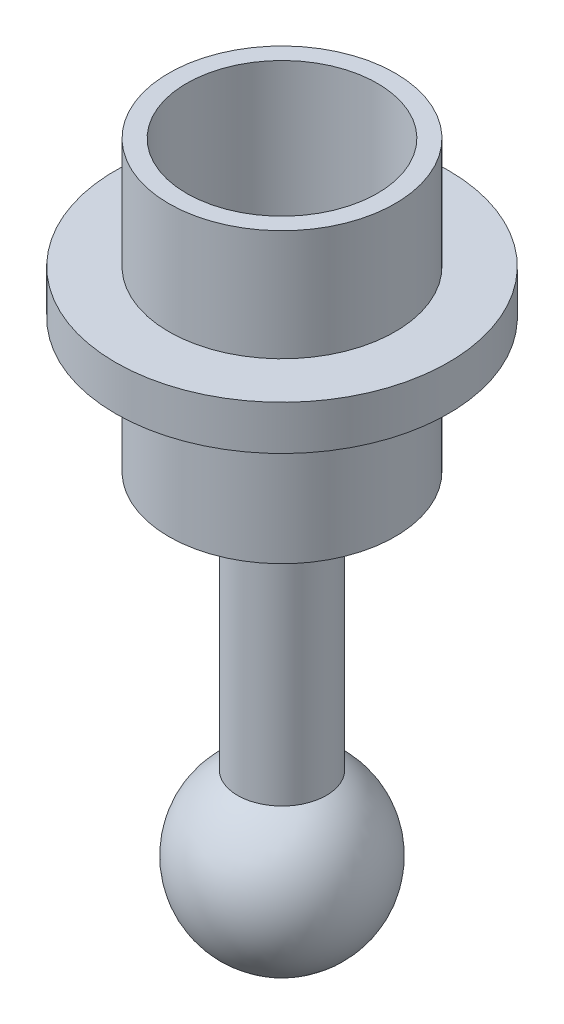
ISO-10303-21;
HEADER;
FILE_DESCRIPTION(('STEP AP214'),'2;1');
FILE_NAME('part.step','',(''),(''),'','','');
FILE_SCHEMA(('AUTOMOTIVE_DESIGN { 1 0 10303 214 1 1 1 1 }'));
ENDSEC;
DATA;
#1=APPLICATION_CONTEXT('core data for automotive mechanical design processes');
#2=APPLICATION_PROTOCOL_DEFINITION('international standard','automotive_design',2000,#1);
#3=PRODUCT_CONTEXT('',#1,'mechanical');
#4=PRODUCT('Part','Part','',(#3));
#5=PRODUCT_RELATED_PRODUCT_CATEGORY('part','',(#4));
#6=PRODUCT_DEFINITION_FORMATION('','',#4);
#7=PRODUCT_DEFINITION_CONTEXT('part definition',#1,'design');
#8=PRODUCT_DEFINITION('design','',#6,#7);
#9=PRODUCT_DEFINITION_SHAPE('','',#8);
#10=(LENGTH_UNIT() NAMED_UNIT(*) SI_UNIT(.MILLI.,.METRE.));
#11=(NAMED_UNIT(*) PLANE_ANGLE_UNIT() SI_UNIT($,.RADIAN.));
#12=(NAMED_UNIT(*) SI_UNIT($,.STERADIAN.) SOLID_ANGLE_UNIT());
#13=UNCERTAINTY_MEASURE_WITH_UNIT(LENGTH_MEASURE(1.E-05),#10,'distance_accuracy_value','');
#14=(GEOMETRIC_REPRESENTATION_CONTEXT(3) GLOBAL_UNCERTAINTY_ASSIGNED_CONTEXT((#13)) GLOBAL_UNIT_ASSIGNED_CONTEXT((#10,
#11,#12)) REPRESENTATION_CONTEXT('',''));
#15=CARTESIAN_POINT('',(0.,0.,0.));
#16=DIRECTION('',(0.,0.,1.));
#17=DIRECTION('',(1.,0.,0.));
#18=AXIS2_PLACEMENT_3D('',#15,#16,#17);
#19=CARTESIAN_POINT('',(0.,1.,0.));
#20=DIRECTION('',(0.,-1.,0.));
#21=DIRECTION('',(0.,0.,-1.));
#22=AXIS2_PLACEMENT_3D('',#19,#20,#21);
#23=CYLINDRICAL_SURFACE('',#22,5.1);
#24=CARTESIAN_POINT('',(0.,0.,0.));
#25=DIRECTION('',(0.,1.,0.));
#26=DIRECTION('',(0.,0.,1.));
#27=AXIS2_PLACEMENT_3D('',#24,#25,#26);
#28=CIRCLE('',#27,5.1);
#29=CARTESIAN_POINT('',(0.,0.,5.1));
#30=VERTEX_POINT('',#29);
#31=EDGE_CURVE('E405',#30,#30,#28,.T.);
#32=ORIENTED_EDGE('',*,*,#31,.T.);
#33=EDGE_LOOP('',(#32));
#34=FACE_BOUND('',#33,.T.);
#35=CARTESIAN_POINT('',(0.,6.,0.));
#36=DIRECTION('',(0.,1.,0.));
#37=DIRECTION('',(0.,0.,1.));
#38=AXIS2_PLACEMENT_3D('',#35,#36,#37);
#39=CIRCLE('',#38,5.1);
#40=CARTESIAN_POINT('',(0.,6.,5.1));
#41=VERTEX_POINT('',#40);
#42=EDGE_CURVE('E11',#41,#41,#39,.T.);
#43=ORIENTED_EDGE('',*,*,#42,.F.);
#44=EDGE_LOOP('',(#43));
#45=FACE_BOUND('',#44,.T.);
#46=ADVANCED_FACE('F45',(#34,#45),#23,.T.);
#47=CARTESIAN_POINT('',(0.,0.,0.));
#48=DIRECTION('',(0.,1.,0.));
#49=DIRECTION('',(0.,0.,1.));
#50=AXIS2_PLACEMENT_3D('',#47,#48,#49);
#51=PLANE('',#50);
#52=CARTESIAN_POINT('',(0.,0.,0.));
#53=DIRECTION('',(0.,1.,0.));
#54=DIRECTION('',(0.,0.,1.));
#55=AXIS2_PLACEMENT_3D('',#52,#53,#54);
#56=CIRCLE('',#55,2.);
#57=CARTESIAN_POINT('',(0.,0.,2.));
#58=VERTEX_POINT('',#57);
#59=EDGE_CURVE('E753',#58,#58,#56,.T.);
#60=ORIENTED_EDGE('',*,*,#59,.T.);
#61=EDGE_LOOP('',(#60));
#62=FACE_BOUND('',#61,.T.);
#63=CARTESIAN_POINT('',(0.,0.,0.));
#64=DIRECTION('',(0.,1.,0.));
#65=DIRECTION('',(0.,0.,1.));
#66=AXIS2_PLACEMENT_3D('',#63,#64,#65);
#67=CIRCLE('',#66,2.5);
#68=CARTESIAN_POINT('',(-2.41481456572267,0.,0.647047612756302));
#69=VERTEX_POINT('',#68);
#70=CARTESIAN_POINT('',(-1.76776695296637,0.,1.76776695296637));
#71=VERTEX_POINT('',#70);
#72=EDGE_CURVE('E328',#69,#71,#67,.T.);
#73=ORIENTED_EDGE('',*,*,#72,.F.);
#74=DIRECTION('',(0.965925826289068,0.,-0.258819045102521));
#75=VECTOR('',#74,1.);
#76=CARTESIAN_POINT('',(0.,0.,0.));
#77=LINE('',#76,#75);
#78=CARTESIAN_POINT('',(-3.18755522675393,0.,0.854102848838318));
#79=VERTEX_POINT('',#78);
#80=EDGE_CURVE('E339',#79,#69,#77,.T.);
#81=ORIENTED_EDGE('',*,*,#80,.F.);
#82=CARTESIAN_POINT('',(0.,0.,0.));
#83=DIRECTION('',(0.,1.,0.));
#84=DIRECTION('',(0.,0.,1.));
#85=AXIS2_PLACEMENT_3D('',#82,#83,#84);
#86=CIRCLE('',#85,3.3);
#87=CARTESIAN_POINT('',(-2.3334523779156,0.,2.33345237791561));
#88=VERTEX_POINT('',#87);
#89=EDGE_CURVE('E68',#79,#88,#86,.T.);
#90=ORIENTED_EDGE('',*,*,#89,.T.);
#91=DIRECTION('',(0.707106781186547,0.,-0.707106781186548));
#92=VECTOR('',#91,1.);
#93=CARTESIAN_POINT('',(0.,0.,0.));
#94=LINE('',#93,#92);
#95=EDGE_CURVE('E316',#88,#71,#94,.T.);
#96=ORIENTED_EDGE('',*,*,#95,.T.);
#97=EDGE_LOOP('',(#73,#81,#90,#96));
#98=FACE_BOUND('',#97,.T.);
#99=CARTESIAN_POINT('',(0.,0.,0.));
#100=DIRECTION('',(0.,1.,0.));
#101=DIRECTION('',(0.,0.,1.));
#102=AXIS2_PLACEMENT_3D('',#99,#100,#101);
#103=CIRCLE('',#102,2.5);
#104=CARTESIAN_POINT('',(1.76776695296637,0.,1.76776695296637));
#105=VERTEX_POINT('',#104);
#106=CARTESIAN_POINT('',(2.41481456572267,0.,0.647047612756299));
#107=VERTEX_POINT('',#106);
#108=EDGE_CURVE('E266',#105,#107,#103,.T.);
#109=ORIENTED_EDGE('',*,*,#108,.F.);
#110=DIRECTION('',(-0.707106781186548,0.,-0.707106781186547));
#111=VECTOR('',#110,1.);
#112=CARTESIAN_POINT('',(0.,0.,0.));
#113=LINE('',#112,#111);
#114=CARTESIAN_POINT('',(2.33345237791561,0.,2.33345237791561));
#115=VERTEX_POINT('',#114);
#116=EDGE_CURVE('E279',#115,#105,#113,.T.);
#117=ORIENTED_EDGE('',*,*,#116,.F.);
#118=CARTESIAN_POINT('',(0.,0.,0.));
#119=DIRECTION('',(0.,1.,0.));
#120=DIRECTION('',(0.,0.,1.));
#121=AXIS2_PLACEMENT_3D('',#118,#119,#120);
#122=CIRCLE('',#121,3.3);
#123=CARTESIAN_POINT('',(3.18755522675393,0.,0.854102848838315));
#124=VERTEX_POINT('',#123);
#125=EDGE_CURVE('E276',#115,#124,#122,.T.);
#126=ORIENTED_EDGE('',*,*,#125,.T.);
#127=DIRECTION('',(-0.965925826289069,0.,-0.258819045102519));
#128=VECTOR('',#127,1.);
#129=CARTESIAN_POINT('',(0.,0.,0.));
#130=LINE('',#129,#128);
#131=EDGE_CURVE('E254',#124,#107,#130,.T.);
#132=ORIENTED_EDGE('',*,*,#131,.T.);
#133=EDGE_LOOP('',(#109,#117,#126,#132));
#134=FACE_BOUND('',#133,.T.);
#135=CARTESIAN_POINT('',(0.,0.,0.));
#136=DIRECTION('',(0.,1.,0.));
#137=DIRECTION('',(0.,0.,1.));
#138=AXIS2_PLACEMENT_3D('',#135,#136,#137);
#139=CIRCLE('',#138,2.5);
#140=CARTESIAN_POINT('',(-1.76776695296637,0.,-1.76776695296637));
#141=VERTEX_POINT('',#140);
#142=CARTESIAN_POINT('',(-2.41481456572267,0.,-0.647047612756298));
#143=VERTEX_POINT('',#142);
#144=EDGE_CURVE('E372',#141,#143,#139,.T.);
#145=ORIENTED_EDGE('',*,*,#144,.F.);
#146=DIRECTION('',(0.707106781186548,0.,0.707106781186547));
#147=VECTOR('',#146,1.);
#148=CARTESIAN_POINT('',(0.,0.,0.));
#149=LINE('',#148,#147);
#150=CARTESIAN_POINT('',(-2.33345237791561,0.,-2.33345237791561));
#151=VERTEX_POINT('',#150);
#152=EDGE_CURVE('E374',#151,#141,#149,.T.);
#153=ORIENTED_EDGE('',*,*,#152,.F.);
#154=CARTESIAN_POINT('',(0.,0.,0.));
#155=DIRECTION('',(0.,1.,0.));
#156=DIRECTION('',(0.,0.,1.));
#157=AXIS2_PLACEMENT_3D('',#154,#155,#156);
#158=CIRCLE('',#157,3.3);
#159=CARTESIAN_POINT('',(-3.18755522675393,0.,-0.854102848838313));
#160=VERTEX_POINT('',#159);
#161=EDGE_CURVE('E377',#151,#160,#158,.T.);
#162=ORIENTED_EDGE('',*,*,#161,.T.);
#163=DIRECTION('',(0.965925826289069,0.,0.258819045102519));
#164=VECTOR('',#163,1.);
#165=CARTESIAN_POINT('',(0.,0.,0.));
#166=LINE('',#165,#164);
#167=EDGE_CURVE('E380',#160,#143,#166,.T.);
#168=ORIENTED_EDGE('',*,*,#167,.T.);
#169=EDGE_LOOP('',(#145,#153,#162,#168));
#170=FACE_BOUND('',#169,.T.);
#171=ORIENTED_EDGE('',*,*,#31,.F.);
#172=EDGE_LOOP('',(#171));
#173=FACE_BOUND('',#172,.T.);
#174=CARTESIAN_POINT('',(0.,0.,0.));
#175=DIRECTION('',(0.,1.,0.));
#176=DIRECTION('',(0.,0.,1.));
#177=AXIS2_PLACEMENT_3D('',#174,#175,#176);
#178=CIRCLE('',#177,2.5);
#179=CARTESIAN_POINT('',(2.41481456572267,0.,-0.647047612756301));
#180=VERTEX_POINT('',#179);
#181=CARTESIAN_POINT('',(1.76776695296637,0.,-1.76776695296637));
#182=VERTEX_POINT('',#181);
#183=EDGE_CURVE('E214',#180,#182,#178,.T.);
#184=ORIENTED_EDGE('',*,*,#183,.F.);
#185=DIRECTION('',(-0.965925826289068,0.,0.25881904510252));
#186=VECTOR('',#185,1.);
#187=CARTESIAN_POINT('',(0.,0.,0.));
#188=LINE('',#187,#186);
#189=CARTESIAN_POINT('',(3.18755522675393,0.,-0.854102848838317));
#190=VERTEX_POINT('',#189);
#191=EDGE_CURVE('E248',#190,#180,#188,.T.);
#192=ORIENTED_EDGE('',*,*,#191,.F.);
#193=CARTESIAN_POINT('',(0.,0.,0.));
#194=DIRECTION('',(0.,1.,0.));
#195=DIRECTION('',(0.,0.,1.));
#196=AXIS2_PLACEMENT_3D('',#193,#194,#195);
#197=CIRCLE('',#196,3.3);
#198=CARTESIAN_POINT('',(2.3334523779156,0.,-2.33345237791561));
#199=VERTEX_POINT('',#198);
#200=EDGE_CURVE('E244',#190,#199,#197,.T.);
#201=ORIENTED_EDGE('',*,*,#200,.T.);
#202=DIRECTION('',(-0.707106781186547,0.,0.707106781186548));
#203=VECTOR('',#202,1.);
#204=CARTESIAN_POINT('',(0.,0.,0.));
#205=LINE('',#204,#203);
#206=EDGE_CURVE('E242',#199,#182,#205,.T.);
#207=ORIENTED_EDGE('',*,*,#206,.T.);
#208=EDGE_LOOP('',(#184,#192,#201,#207));
#209=FACE_BOUND('',#208,.T.);
#210=CARTESIAN_POINT('',(0.,0.,0.));
#211=DIRECTION('',(0.,1.,0.));
#212=DIRECTION('',(0.,0.,1.));
#213=AXIS2_PLACEMENT_3D('',#210,#211,#212);
#214=CIRCLE('',#213,2.5);
#215=CARTESIAN_POINT('',(-0.647047612756303,0.,2.41481456572267));
#216=VERTEX_POINT('',#215);
#217=CARTESIAN_POINT('',(0.647047612756304,0.,2.41481456572267));
#218=VERTEX_POINT('',#217);
#219=EDGE_CURVE('E297',#216,#218,#214,.T.);
#220=ORIENTED_EDGE('',*,*,#219,.F.);
#221=DIRECTION('',(0.258819045102521,0.,-0.965925826289068));
#222=VECTOR('',#221,1.);
#223=CARTESIAN_POINT('',(0.,0.,0.));
#224=LINE('',#223,#222);
#225=CARTESIAN_POINT('',(-0.85410284883832,0.,3.18755522675393));
#226=VERTEX_POINT('',#225);
#227=EDGE_CURVE('E310',#226,#216,#224,.T.);
#228=ORIENTED_EDGE('',*,*,#227,.F.);
#229=CARTESIAN_POINT('',(0.,0.,0.));
#230=DIRECTION('',(0.,1.,0.));
#231=DIRECTION('',(0.,0.,1.));
#232=AXIS2_PLACEMENT_3D('',#229,#230,#231);
#233=CIRCLE('',#232,3.3);
#234=CARTESIAN_POINT('',(0.854102848838322,0.,3.18755522675392));
#235=VERTEX_POINT('',#234);
#236=EDGE_CURVE('E307',#226,#235,#233,.T.);
#237=ORIENTED_EDGE('',*,*,#236,.T.);
#238=DIRECTION('',(-0.258819045102522,0.,-0.965925826289068));
#239=VECTOR('',#238,1.);
#240=CARTESIAN_POINT('',(0.,0.,0.));
#241=LINE('',#240,#239);
#242=EDGE_CURVE('E285',#235,#218,#241,.T.);
#243=ORIENTED_EDGE('',*,*,#242,.T.);
#244=EDGE_LOOP('',(#220,#228,#237,#243));
#245=FACE_BOUND('',#244,.T.);
#246=DIRECTION('',(-0.258819045102521,0.,0.965925826289068));
#247=VECTOR('',#246,1.);
#248=CARTESIAN_POINT('',(0.854102848838321,0.,-3.18755522675393));
#249=LINE('',#248,#247);
#250=CARTESIAN_POINT('',(0.854102848838321,0.,-3.18755522675392));
#251=VERTEX_POINT('',#250);
#252=CARTESIAN_POINT('',(0.647047612756304,0.,-2.41481456572267));
#253=VERTEX_POINT('',#252);
#254=EDGE_CURVE('E358',#251,#253,#249,.T.);
#255=ORIENTED_EDGE('',*,*,#254,.F.);
#256=CARTESIAN_POINT('',(0.,0.,0.));
#257=DIRECTION('',(0.,1.,0.));
#258=DIRECTION('',(0.,0.,1.));
#259=AXIS2_PLACEMENT_3D('',#256,#257,#258);
#260=CIRCLE('',#259,3.3);
#261=CARTESIAN_POINT('',(-0.854102848838322,0.,-3.18755522675392));
#262=VERTEX_POINT('',#261);
#263=EDGE_CURVE('E353',#251,#262,#260,.T.);
#264=ORIENTED_EDGE('',*,*,#263,.T.);
#265=DIRECTION('',(0.258819045102522,0.,0.965925826289068));
#266=VECTOR('',#265,1.);
#267=CARTESIAN_POINT('',(-0.854102848838321,0.,-3.18755522675392));
#268=LINE('',#267,#266);
#269=CARTESIAN_POINT('',(-0.647047612756304,0.,-2.41481456572267));
#270=VERTEX_POINT('',#269);
#271=EDGE_CURVE('E60',#262,#270,#268,.T.);
#272=ORIENTED_EDGE('',*,*,#271,.T.);
#273=CARTESIAN_POINT('',(0.,0.,0.));
#274=DIRECTION('',(0.,1.,0.));
#275=DIRECTION('',(0.,0.,1.));
#276=AXIS2_PLACEMENT_3D('',#273,#274,#275);
#277=CIRCLE('',#276,2.5);
#278=EDGE_CURVE('E369',#253,#270,#277,.T.);
#279=ORIENTED_EDGE('',*,*,#278,.F.);
#280=EDGE_LOOP('',(#255,#264,#272,#279));
#281=FACE_BOUND('',#280,.T.);
#282=ADVANCED_FACE('F414',(#62,#98,#134,#170,#173,#209,#245,#281),#51,.F.);
#283=CARTESIAN_POINT('',(0.,1.,0.));
#284=DIRECTION('',(0.,1.,0.));
#285=DIRECTION('',(0.,0.,1.));
#286=AXIS2_PLACEMENT_3D('',#283,#284,#285);
#287=PLANE('',#286);
#288=CARTESIAN_POINT('',(0.,1.,0.));
#289=DIRECTION('',(0.,1.,0.));
#290=DIRECTION('',(0.,0.,1.));
#291=AXIS2_PLACEMENT_3D('',#288,#289,#290);
#292=CIRCLE('',#291,4.3);
#293=CARTESIAN_POINT('',(0.,1.,4.3));
#294=VERTEX_POINT('',#293);
#295=EDGE_CURVE('E53',#294,#294,#292,.F.);
#296=ORIENTED_EDGE('',*,*,#295,.F.);
#297=EDGE_LOOP('',(#296));
#298=FACE_BOUND('',#297,.T.);
#299=DIRECTION('',(0.707106781186548,0.,0.707106781186547));
#300=VECTOR('',#299,1.);
#301=CARTESIAN_POINT('',(0.,1.,0.));
#302=LINE('',#301,#300);
#303=CARTESIAN_POINT('',(-2.33345237791561,1.,-2.33345237791561));
#304=VERTEX_POINT('',#303);
#305=CARTESIAN_POINT('',(-1.76776695296637,1.,-1.76776695296637));
#306=VERTEX_POINT('',#305);
#307=EDGE_CURVE('E237',#304,#306,#302,.T.);
#308=ORIENTED_EDGE('',*,*,#307,.T.);
#309=CARTESIAN_POINT('',(0.,1.,0.));
#310=DIRECTION('',(0.,1.,0.));
#311=DIRECTION('',(0.,0.,1.));
#312=AXIS2_PLACEMENT_3D('',#309,#310,#311);
#313=CIRCLE('',#312,2.5);
#314=CARTESIAN_POINT('',(-2.41481456572267,1.,-0.647047612756298));
#315=VERTEX_POINT('',#314);
#316=EDGE_CURVE('E234',#306,#315,#313,.T.);
#317=ORIENTED_EDGE('',*,*,#316,.T.);
#318=DIRECTION('',(0.965925826289069,0.,0.258819045102519));
#319=VECTOR('',#318,1.);
#320=CARTESIAN_POINT('',(0.,1.,0.));
#321=LINE('',#320,#319);
#322=CARTESIAN_POINT('',(-3.18755522675393,1.,-0.854102848838313));
#323=VERTEX_POINT('',#322);
#324=EDGE_CURVE('E375',#323,#315,#321,.T.);
#325=ORIENTED_EDGE('',*,*,#324,.F.);
#326=CARTESIAN_POINT('',(0.,1.,0.));
#327=DIRECTION('',(0.,1.,0.));
#328=DIRECTION('',(0.,0.,1.));
#329=AXIS2_PLACEMENT_3D('',#326,#327,#328);
#330=CIRCLE('',#329,3.3);
#331=EDGE_CURVE('E386',#304,#323,#330,.T.);
#332=ORIENTED_EDGE('',*,*,#331,.F.);
#333=EDGE_LOOP('',(#308,#317,#325,#332));
#334=FACE_BOUND('',#333,.T.);
#335=DIRECTION('',(-0.965925826289068,0.,0.25881904510252));
#336=VECTOR('',#335,1.);
#337=CARTESIAN_POINT('',(0.,1.,0.));
#338=LINE('',#337,#336);
#339=CARTESIAN_POINT('',(3.18755522675393,1.,-0.854102848838317));
#340=VERTEX_POINT('',#339);
#341=CARTESIAN_POINT('',(2.41481456572267,1.,-0.6470476127563));
#342=VERTEX_POINT('',#341);
#343=EDGE_CURVE('E233',#340,#342,#338,.T.);
#344=ORIENTED_EDGE('',*,*,#343,.T.);
#345=CARTESIAN_POINT('',(0.,1.,0.));
#346=DIRECTION('',(0.,1.,0.));
#347=DIRECTION('',(0.,0.,1.));
#348=AXIS2_PLACEMENT_3D('',#345,#346,#347);
#349=CIRCLE('',#348,2.5);
#350=CARTESIAN_POINT('',(1.76776695296637,1.,-1.76776695296637));
#351=VERTEX_POINT('',#350);
#352=EDGE_CURVE('E211',#342,#351,#349,.T.);
#353=ORIENTED_EDGE('',*,*,#352,.T.);
#354=DIRECTION('',(-0.707106781186547,0.,0.707106781186548));
#355=VECTOR('',#354,1.);
#356=CARTESIAN_POINT('',(0.,1.,0.));
#357=LINE('',#356,#355);
#358=CARTESIAN_POINT('',(2.3334523779156,1.,-2.33345237791561));
#359=VERTEX_POINT('',#358);
#360=EDGE_CURVE('E222',#359,#351,#357,.T.);
#361=ORIENTED_EDGE('',*,*,#360,.F.);
#362=CARTESIAN_POINT('',(0.,1.,0.));
#363=DIRECTION('',(0.,1.,0.));
#364=DIRECTION('',(0.,0.,1.));
#365=AXIS2_PLACEMENT_3D('',#362,#363,#364);
#366=CIRCLE('',#365,3.3);
#367=EDGE_CURVE('E227',#340,#359,#366,.T.);
#368=ORIENTED_EDGE('',*,*,#367,.F.);
#369=EDGE_LOOP('',(#344,#353,#361,#368));
#370=FACE_BOUND('',#369,.T.);
#371=DIRECTION('',(-0.707106781186548,0.,-0.707106781186547));
#372=VECTOR('',#371,1.);
#373=CARTESIAN_POINT('',(0.,1.,0.));
#374=LINE('',#373,#372);
#375=CARTESIAN_POINT('',(2.33345237791561,1.,2.33345237791561));
#376=VERTEX_POINT('',#375);
#377=CARTESIAN_POINT('',(1.76776695296637,1.,1.76776695296637));
#378=VERTEX_POINT('',#377);
#379=EDGE_CURVE('E269',#376,#378,#374,.T.);
#380=ORIENTED_EDGE('',*,*,#379,.T.);
#381=CARTESIAN_POINT('',(0.,1.,0.));
#382=DIRECTION('',(0.,1.,0.));
#383=DIRECTION('',(0.,0.,1.));
#384=AXIS2_PLACEMENT_3D('',#381,#382,#383);
#385=CIRCLE('',#384,2.5);
#386=CARTESIAN_POINT('',(2.41481456572267,1.,0.647047612756299));
#387=VERTEX_POINT('',#386);
#388=EDGE_CURVE('E219',#378,#387,#385,.T.);
#389=ORIENTED_EDGE('',*,*,#388,.T.);
#390=DIRECTION('',(-0.965925826289069,0.,-0.258819045102519));
#391=VECTOR('',#390,1.);
#392=CARTESIAN_POINT('',(0.,1.,0.));
#393=LINE('',#392,#391);
#394=CARTESIAN_POINT('',(3.18755522675393,1.,0.854102848838315));
#395=VERTEX_POINT('',#394);
#396=EDGE_CURVE('E262',#395,#387,#393,.T.);
#397=ORIENTED_EDGE('',*,*,#396,.F.);
#398=CARTESIAN_POINT('',(0.,1.,0.));
#399=DIRECTION('',(0.,1.,0.));
#400=DIRECTION('',(0.,0.,1.));
#401=AXIS2_PLACEMENT_3D('',#398,#399,#400);
#402=CIRCLE('',#401,3.3);
#403=EDGE_CURVE('E265',#376,#395,#402,.T.);
#404=ORIENTED_EDGE('',*,*,#403,.F.);
#405=EDGE_LOOP('',(#380,#389,#397,#404));
#406=FACE_BOUND('',#405,.T.);
#407=DIRECTION('',(0.258819045102521,0.,-0.965925826289068));
#408=VECTOR('',#407,1.);
#409=CARTESIAN_POINT('',(0.,1.,0.));
#410=LINE('',#409,#408);
#411=CARTESIAN_POINT('',(-0.85410284883832,1.,3.18755522675393));
#412=VERTEX_POINT('',#411);
#413=CARTESIAN_POINT('',(-0.647047612756303,1.,2.41481456572267));
#414=VERTEX_POINT('',#413);
#415=EDGE_CURVE('E300',#412,#414,#410,.T.);
#416=ORIENTED_EDGE('',*,*,#415,.T.);
#417=CARTESIAN_POINT('',(0.,1.,0.));
#418=DIRECTION('',(0.,1.,0.));
#419=DIRECTION('',(0.,0.,1.));
#420=AXIS2_PLACEMENT_3D('',#417,#418,#419);
#421=CIRCLE('',#420,2.5);
#422=CARTESIAN_POINT('',(0.647047612756304,1.,2.41481456572267));
#423=VERTEX_POINT('',#422);
#424=EDGE_CURVE('E261',#414,#423,#421,.T.);
#425=ORIENTED_EDGE('',*,*,#424,.T.);
#426=DIRECTION('',(-0.258819045102522,0.,-0.965925826289068));
#427=VECTOR('',#426,1.);
#428=CARTESIAN_POINT('',(0.,1.,0.));
#429=LINE('',#428,#427);
#430=CARTESIAN_POINT('',(0.854102848838322,1.,3.18755522675392));
#431=VERTEX_POINT('',#430);
#432=EDGE_CURVE('E293',#431,#423,#429,.T.);
#433=ORIENTED_EDGE('',*,*,#432,.F.);
#434=CARTESIAN_POINT('',(0.,1.,0.));
#435=DIRECTION('',(0.,1.,0.));
#436=DIRECTION('',(0.,0.,1.));
#437=AXIS2_PLACEMENT_3D('',#434,#435,#436);
#438=CIRCLE('',#437,3.3);
#439=EDGE_CURVE('E296',#412,#431,#438,.T.);
#440=ORIENTED_EDGE('',*,*,#439,.F.);
#441=EDGE_LOOP('',(#416,#425,#433,#440));
#442=FACE_BOUND('',#441,.T.);
#443=DIRECTION('',(0.965925826289068,0.,-0.258819045102521));
#444=VECTOR('',#443,1.);
#445=CARTESIAN_POINT('',(0.,1.,0.));
#446=LINE('',#445,#444);
#447=CARTESIAN_POINT('',(-3.18755522675393,1.,0.854102848838318));
#448=VERTEX_POINT('',#447);
#449=CARTESIAN_POINT('',(-2.41481456572267,1.,0.647047612756302));
#450=VERTEX_POINT('',#449);
#451=EDGE_CURVE('E331',#448,#450,#446,.T.);
#452=ORIENTED_EDGE('',*,*,#451,.T.);
#453=CARTESIAN_POINT('',(0.,1.,0.));
#454=DIRECTION('',(0.,1.,0.));
#455=DIRECTION('',(0.,0.,1.));
#456=AXIS2_PLACEMENT_3D('',#453,#454,#455);
#457=CIRCLE('',#456,2.5);
#458=CARTESIAN_POINT('',(-1.76776695296637,1.,1.76776695296637));
#459=VERTEX_POINT('',#458);
#460=EDGE_CURVE('E292',#450,#459,#457,.T.);
#461=ORIENTED_EDGE('',*,*,#460,.T.);
#462=DIRECTION('',(0.707106781186547,0.,-0.707106781186548));
#463=VECTOR('',#462,1.);
#464=CARTESIAN_POINT('',(0.,1.,0.));
#465=LINE('',#464,#463);
#466=CARTESIAN_POINT('',(-2.3334523779156,1.,2.33345237791561));
#467=VERTEX_POINT('',#466);
#468=EDGE_CURVE('E324',#467,#459,#465,.T.);
#469=ORIENTED_EDGE('',*,*,#468,.F.);
#470=CARTESIAN_POINT('',(0.,1.,0.));
#471=DIRECTION('',(0.,1.,0.));
#472=DIRECTION('',(0.,0.,1.));
#473=AXIS2_PLACEMENT_3D('',#470,#471,#472);
#474=CIRCLE('',#473,3.3);
#475=EDGE_CURVE('E327',#448,#467,#474,.T.);
#476=ORIENTED_EDGE('',*,*,#475,.F.);
#477=EDGE_LOOP('',(#452,#461,#469,#476));
#478=FACE_BOUND('',#477,.T.);
#479=CARTESIAN_POINT('',(0.,1.,0.));
#480=DIRECTION('',(0.,1.,0.));
#481=DIRECTION('',(0.,0.,1.));
#482=AXIS2_PLACEMENT_3D('',#479,#480,#481);
#483=CIRCLE('',#482,3.3);
#484=CARTESIAN_POINT('',(0.854102848838321,1.,-3.18755522675392));
#485=VERTEX_POINT('',#484);
#486=CARTESIAN_POINT('',(-0.854102848838321,1.,-3.18755522675392));
#487=VERTEX_POINT('',#486);
#488=EDGE_CURVE('E354',#485,#487,#483,.T.);
#489=ORIENTED_EDGE('',*,*,#488,.F.);
#490=DIRECTION('',(-0.258819045102521,0.,0.965925826289068));
#491=VECTOR('',#490,1.);
#492=CARTESIAN_POINT('',(0.854102848838321,1.,-3.18755522675393));
#493=LINE('',#492,#491);
#494=CARTESIAN_POINT('',(0.647047612756304,1.,-2.41481456572267));
#495=VERTEX_POINT('',#494);
#496=EDGE_CURVE('E323',#485,#495,#493,.T.);
#497=ORIENTED_EDGE('',*,*,#496,.T.);
#498=CARTESIAN_POINT('',(0.,1.,0.));
#499=DIRECTION('',(0.,1.,0.));
#500=DIRECTION('',(0.,0.,1.));
#501=AXIS2_PLACEMENT_3D('',#498,#499,#500);
#502=CIRCLE('',#501,2.5);
#503=CARTESIAN_POINT('',(-0.647047612756304,1.,-2.41481456572267));
#504=VERTEX_POINT('',#503);
#505=EDGE_CURVE('E361',#495,#504,#502,.T.);
#506=ORIENTED_EDGE('',*,*,#505,.T.);
#507=DIRECTION('',(0.258819045102522,0.,0.965925826289068));
#508=VECTOR('',#507,1.);
#509=CARTESIAN_POINT('',(-0.854102848838321,1.,-3.18755522675392));
#510=LINE('',#509,#508);
#511=EDGE_CURVE('E357',#487,#504,#510,.T.);
#512=ORIENTED_EDGE('',*,*,#511,.F.);
#513=EDGE_LOOP('',(#489,#497,#506,#512));
#514=FACE_BOUND('',#513,.T.);
#515=ADVANCED_FACE('F230',(#298,#334,#370,#406,#442,#478,#514),#287,.T.);
#516=CARTESIAN_POINT('',(0.,8.,0.));
#517=DIRECTION('',(0.,1.,0.));
#518=DIRECTION('',(0.,0.,1.));
#519=AXIS2_PLACEMENT_3D('',#516,#517,#518);
#520=CIRCLE('',#519,5.1);
#521=CARTESIAN_POINT('',(0.,8.,5.1));
#522=VERTEX_POINT('',#521);
#523=EDGE_CURVE('E463',#522,#522,#520,.T.);
#524=ORIENTED_EDGE('',*,*,#523,.T.);
#525=EDGE_LOOP('',(#524));
#526=FACE_BOUND('',#525,.T.);
#527=CARTESIAN_POINT('',(0.,13.,0.));
#528=DIRECTION('',(0.,1.,0.));
#529=DIRECTION('',(0.,0.,1.));
#530=AXIS2_PLACEMENT_3D('',#527,#528,#529);
#531=CIRCLE('',#530,5.1);
#532=CARTESIAN_POINT('',(0.,13.,5.1));
#533=VERTEX_POINT('',#532);
#534=EDGE_CURVE('E402',#533,#533,#531,.T.);
#535=ORIENTED_EDGE('',*,*,#534,.F.);
#536=EDGE_LOOP('',(#535));
#537=FACE_BOUND('',#536,.T.);
#538=ADVANCED_FACE('F47',(#526,#537),#23,.T.);
#539=CARTESIAN_POINT('',(0.,13.,0.));
#540=DIRECTION('',(0.,-1.,0.));
#541=DIRECTION('',(0.,0.,-1.));
#542=AXIS2_PLACEMENT_3D('',#539,#540,#541);
#543=CYLINDRICAL_SURFACE('',#542,4.3);
#544=CARTESIAN_POINT('',(0.,13.,0.));
#545=DIRECTION('',(0.,1.,0.));
#546=DIRECTION('',(0.,0.,1.));
#547=AXIS2_PLACEMENT_3D('',#544,#545,#546);
#548=CIRCLE('',#547,4.3);
#549=CARTESIAN_POINT('',(0.,13.,4.3));
#550=VERTEX_POINT('',#549);
#551=EDGE_CURVE('E393',#550,#550,#548,.T.);
#552=ORIENTED_EDGE('',*,*,#551,.T.);
#553=EDGE_LOOP('',(#552));
#554=FACE_BOUND('',#553,.T.);
#555=ORIENTED_EDGE('',*,*,#295,.T.);
#556=EDGE_LOOP('',(#555));
#557=FACE_BOUND('',#556,.T.);
#558=ADVANCED_FACE('F410',(#554,#557),#543,.F.);
#559=CARTESIAN_POINT('',(0.,13.,0.));
#560=DIRECTION('',(0.,1.,0.));
#561=DIRECTION('',(0.,0.,1.));
#562=AXIS2_PLACEMENT_3D('',#559,#560,#561);
#563=PLANE('',#562);
#564=ORIENTED_EDGE('',*,*,#551,.F.);
#565=EDGE_LOOP('',(#564));
#566=FACE_BOUND('',#565,.T.);
#567=ORIENTED_EDGE('',*,*,#534,.T.);
#568=EDGE_LOOP('',(#567));
#569=FACE_BOUND('',#568,.T.);
#570=ADVANCED_FACE('F457',(#566,#569),#563,.T.);
#571=CARTESIAN_POINT('',(0.,0.,0.));
#572=DIRECTION('',(0.,1.,0.));
#573=DIRECTION('',(0.,0.,1.));
#574=AXIS2_PLACEMENT_3D('',#571,#572,#573);
#575=CYLINDRICAL_SURFACE('',#574,2.5);
#576=ORIENTED_EDGE('',*,*,#316,.F.);
#577=DIRECTION('',(0.,1.,0.));
#578=VECTOR('',#577,1.);
#579=CARTESIAN_POINT('',(-1.76776695296637,0.,-1.76776695296637));
#580=LINE('',#579,#578);
#581=EDGE_CURVE('E382',#141,#306,#580,.T.);
#582=ORIENTED_EDGE('',*,*,#581,.F.);
#583=ORIENTED_EDGE('',*,*,#144,.T.);
#584=DIRECTION('',(0.,1.,0.));
#585=VECTOR('',#584,1.);
#586=CARTESIAN_POINT('',(-2.41481456572267,0.,-0.647047612756298));
#587=LINE('',#586,#585);
#588=EDGE_CURVE('E391',#143,#315,#587,.T.);
#589=ORIENTED_EDGE('',*,*,#588,.T.);
#590=EDGE_LOOP('',(#576,#582,#583,#589));
#591=FACE_BOUND('',#590,.T.);
#592=ADVANCED_FACE('F426',(#591),#575,.T.);
#593=CARTESIAN_POINT('',(0.,0.,0.));
#594=DIRECTION('',(-0.258819045102519,0.,0.965925826289069));
#595=DIRECTION('',(0.965925826289069,0.,0.258819045102519));
#596=AXIS2_PLACEMENT_3D('',#593,#594,#595);
#597=PLANE('',#596);
#598=ORIENTED_EDGE('',*,*,#324,.T.);
#599=ORIENTED_EDGE('',*,*,#588,.F.);
#600=ORIENTED_EDGE('',*,*,#167,.F.);
#601=DIRECTION('',(0.,1.,0.));
#602=VECTOR('',#601,1.);
#603=CARTESIAN_POINT('',(-3.18755522675393,0.,-0.854102848838313));
#604=LINE('',#603,#602);
#605=EDGE_CURVE('E394',#160,#323,#604,.T.);
#606=ORIENTED_EDGE('',*,*,#605,.T.);
#607=EDGE_LOOP('',(#598,#599,#600,#606));
#608=FACE_BOUND('',#607,.T.);
#609=ADVANCED_FACE('F432',(#608),#597,.F.);
#610=CARTESIAN_POINT('',(0.,0.,0.));
#611=DIRECTION('',(0.,1.,0.));
#612=DIRECTION('',(0.,0.,1.));
#613=AXIS2_PLACEMENT_3D('',#610,#611,#612);
#614=CYLINDRICAL_SURFACE('',#613,3.3);
#615=ORIENTED_EDGE('',*,*,#331,.T.);
#616=ORIENTED_EDGE('',*,*,#605,.F.);
#617=ORIENTED_EDGE('',*,*,#161,.F.);
#618=DIRECTION('',(0.,1.,0.));
#619=VECTOR('',#618,1.);
#620=CARTESIAN_POINT('',(-2.33345237791561,0.,-2.33345237791561));
#621=LINE('',#620,#619);
#622=EDGE_CURVE('E396',#151,#304,#621,.T.);
#623=ORIENTED_EDGE('',*,*,#622,.T.);
#624=EDGE_LOOP('',(#615,#616,#617,#623));
#625=FACE_BOUND('',#624,.T.);
#626=ADVANCED_FACE('F434',(#625),#614,.F.);
#627=CARTESIAN_POINT('',(0.,0.,0.));
#628=DIRECTION('',(-0.707106781186547,0.,0.707106781186548));
#629=DIRECTION('',(0.707106781186548,0.,0.707106781186547));
#630=AXIS2_PLACEMENT_3D('',#627,#628,#629);
#631=PLANE('',#630);
#632=ORIENTED_EDGE('',*,*,#307,.F.);
#633=ORIENTED_EDGE('',*,*,#622,.F.);
#634=ORIENTED_EDGE('',*,*,#152,.T.);
#635=ORIENTED_EDGE('',*,*,#581,.T.);
#636=EDGE_LOOP('',(#632,#633,#634,#635));
#637=FACE_BOUND('',#636,.T.);
#638=ADVANCED_FACE('F421',(#637),#631,.T.);
#639=CARTESIAN_POINT('',(0.,0.,0.));
#640=DIRECTION('',(0.,1.,0.));
#641=DIRECTION('',(0.,0.,1.));
#642=AXIS2_PLACEMENT_3D('',#639,#640,#641);
#643=CYLINDRICAL_SURFACE('',#642,2.5);
#644=ORIENTED_EDGE('',*,*,#352,.F.);
#645=DIRECTION('',(0.,1.,0.));
#646=VECTOR('',#645,1.);
#647=CARTESIAN_POINT('',(2.41481456572267,0.,-0.647047612756301));
#648=LINE('',#647,#646);
#649=EDGE_CURVE('E245',#180,#342,#648,.T.);
#650=ORIENTED_EDGE('',*,*,#649,.F.);
#651=ORIENTED_EDGE('',*,*,#183,.T.);
#652=DIRECTION('',(0.,1.,0.));
#653=VECTOR('',#652,1.);
#654=CARTESIAN_POINT('',(1.76776695296637,0.,-1.76776695296637));
#655=LINE('',#654,#653);
#656=EDGE_CURVE('E206',#182,#351,#655,.T.);
#657=ORIENTED_EDGE('',*,*,#656,.T.);
#658=EDGE_LOOP('',(#644,#650,#651,#657));
#659=FACE_BOUND('',#658,.T.);
#660=ADVANCED_FACE('F208',(#659),#643,.T.);
#661=CARTESIAN_POINT('',(0.,0.,0.));
#662=DIRECTION('',(-0.707106781186548,0.,-0.707106781186547));
#663=DIRECTION('',(-0.707106781186547,0.,0.707106781186548));
#664=AXIS2_PLACEMENT_3D('',#661,#662,#663);
#665=PLANE('',#664);
#666=ORIENTED_EDGE('',*,*,#360,.T.);
#667=ORIENTED_EDGE('',*,*,#656,.F.);
#668=ORIENTED_EDGE('',*,*,#206,.F.);
#669=DIRECTION('',(0.,1.,0.));
#670=VECTOR('',#669,1.);
#671=CARTESIAN_POINT('',(2.3334523779156,0.,-2.33345237791561));
#672=LINE('',#671,#670);
#673=EDGE_CURVE('E218',#199,#359,#672,.T.);
#674=ORIENTED_EDGE('',*,*,#673,.T.);
#675=EDGE_LOOP('',(#666,#667,#668,#674));
#676=FACE_BOUND('',#675,.T.);
#677=ADVANCED_FACE('F223',(#676),#665,.F.);
#678=CARTESIAN_POINT('',(0.,0.,0.));
#679=DIRECTION('',(0.,1.,0.));
#680=DIRECTION('',(0.,0.,1.));
#681=AXIS2_PLACEMENT_3D('',#678,#679,#680);
#682=CYLINDRICAL_SURFACE('',#681,3.3);
#683=ORIENTED_EDGE('',*,*,#367,.T.);
#684=ORIENTED_EDGE('',*,*,#673,.F.);
#685=ORIENTED_EDGE('',*,*,#200,.F.);
#686=DIRECTION('',(0.,1.,0.));
#687=VECTOR('',#686,1.);
#688=CARTESIAN_POINT('',(3.18755522675393,0.,-0.854102848838317));
#689=LINE('',#688,#687);
#690=EDGE_CURVE('E765',#190,#340,#689,.T.);
#691=ORIENTED_EDGE('',*,*,#690,.T.);
#692=EDGE_LOOP('',(#683,#684,#685,#691));
#693=FACE_BOUND('',#692,.T.);
#694=ADVANCED_FACE('F512',(#693),#682,.F.);
#695=CARTESIAN_POINT('',(0.,0.,0.));
#696=DIRECTION('',(-0.25881904510252,0.,-0.965925826289069));
#697=DIRECTION('',(-0.965925826289069,0.,0.25881904510252));
#698=AXIS2_PLACEMENT_3D('',#695,#696,#697);
#699=PLANE('',#698);
#700=ORIENTED_EDGE('',*,*,#343,.F.);
#701=ORIENTED_EDGE('',*,*,#690,.F.);
#702=ORIENTED_EDGE('',*,*,#191,.T.);
#703=ORIENTED_EDGE('',*,*,#649,.T.);
#704=EDGE_LOOP('',(#700,#701,#702,#703));
#705=FACE_BOUND('',#704,.T.);
#706=ADVANCED_FACE('F521',(#705),#699,.T.);
#707=CARTESIAN_POINT('',(0.,0.,0.));
#708=DIRECTION('',(0.,1.,0.));
#709=DIRECTION('',(0.,0.,1.));
#710=AXIS2_PLACEMENT_3D('',#707,#708,#709);
#711=CYLINDRICAL_SURFACE('',#710,2.5);
#712=ORIENTED_EDGE('',*,*,#388,.F.);
#713=DIRECTION('',(0.,1.,0.));
#714=VECTOR('',#713,1.);
#715=CARTESIAN_POINT('',(1.76776695296637,0.,1.76776695296637));
#716=LINE('',#715,#714);
#717=EDGE_CURVE('E251',#105,#378,#716,.T.);
#718=ORIENTED_EDGE('',*,*,#717,.F.);
#719=ORIENTED_EDGE('',*,*,#108,.T.);
#720=DIRECTION('',(0.,1.,0.));
#721=VECTOR('',#720,1.);
#722=CARTESIAN_POINT('',(2.41481456572267,0.,0.647047612756299));
#723=LINE('',#722,#721);
#724=EDGE_CURVE('E259',#107,#387,#723,.T.);
#725=ORIENTED_EDGE('',*,*,#724,.T.);
#726=EDGE_LOOP('',(#712,#718,#719,#725));
#727=FACE_BOUND('',#726,.T.);
#728=ADVANCED_FACE('F531',(#727),#711,.T.);
#729=CARTESIAN_POINT('',(0.,0.,0.));
#730=DIRECTION('',(0.258819045102519,0.,-0.965925826289069));
#731=DIRECTION('',(-0.965925826289069,0.,-0.258819045102519));
#732=AXIS2_PLACEMENT_3D('',#729,#730,#731);
#733=PLANE('',#732);
#734=ORIENTED_EDGE('',*,*,#396,.T.);
#735=ORIENTED_EDGE('',*,*,#724,.F.);
#736=ORIENTED_EDGE('',*,*,#131,.F.);
#737=DIRECTION('',(0.,1.,0.));
#738=VECTOR('',#737,1.);
#739=CARTESIAN_POINT('',(3.18755522675393,0.,0.854102848838315));
#740=LINE('',#739,#738);
#741=EDGE_CURVE('E257',#124,#395,#740,.T.);
#742=ORIENTED_EDGE('',*,*,#741,.T.);
#743=EDGE_LOOP('',(#734,#735,#736,#742));
#744=FACE_BOUND('',#743,.T.);
#745=ADVANCED_FACE('F541',(#744),#733,.F.);
#746=CARTESIAN_POINT('',(0.,0.,0.));
#747=DIRECTION('',(0.,1.,0.));
#748=DIRECTION('',(0.,0.,1.));
#749=AXIS2_PLACEMENT_3D('',#746,#747,#748);
#750=CYLINDRICAL_SURFACE('',#749,3.3);
#751=ORIENTED_EDGE('',*,*,#403,.T.);
#752=ORIENTED_EDGE('',*,*,#741,.F.);
#753=ORIENTED_EDGE('',*,*,#125,.F.);
#754=DIRECTION('',(0.,1.,0.));
#755=VECTOR('',#754,1.);
#756=CARTESIAN_POINT('',(2.33345237791561,0.,2.33345237791561));
#757=LINE('',#756,#755);
#758=EDGE_CURVE('E255',#115,#376,#757,.T.);
#759=ORIENTED_EDGE('',*,*,#758,.T.);
#760=EDGE_LOOP('',(#751,#752,#753,#759));
#761=FACE_BOUND('',#760,.T.);
#762=ADVANCED_FACE('F551',(#761),#750,.F.);
#763=CARTESIAN_POINT('',(0.,0.,0.));
#764=DIRECTION('',(0.707106781186547,0.,-0.707106781186548));
#765=DIRECTION('',(-0.707106781186548,0.,-0.707106781186547));
#766=AXIS2_PLACEMENT_3D('',#763,#764,#765);
#767=PLANE('',#766);
#768=ORIENTED_EDGE('',*,*,#379,.F.);
#769=ORIENTED_EDGE('',*,*,#758,.F.);
#770=ORIENTED_EDGE('',*,*,#116,.T.);
#771=ORIENTED_EDGE('',*,*,#717,.T.);
#772=EDGE_LOOP('',(#768,#769,#770,#771));
#773=FACE_BOUND('',#772,.T.);
#774=ADVANCED_FACE('F561',(#773),#767,.T.);
#775=CARTESIAN_POINT('',(0.,0.,0.));
#776=DIRECTION('',(0.,1.,0.));
#777=DIRECTION('',(0.,0.,1.));
#778=AXIS2_PLACEMENT_3D('',#775,#776,#777);
#779=CYLINDRICAL_SURFACE('',#778,2.5);
#780=ORIENTED_EDGE('',*,*,#424,.F.);
#781=DIRECTION('',(0.,1.,0.));
#782=VECTOR('',#781,1.);
#783=CARTESIAN_POINT('',(-0.647047612756303,0.,2.41481456572267));
#784=LINE('',#783,#782);
#785=EDGE_CURVE('E282',#216,#414,#784,.T.);
#786=ORIENTED_EDGE('',*,*,#785,.F.);
#787=ORIENTED_EDGE('',*,*,#219,.T.);
#788=DIRECTION('',(0.,1.,0.));
#789=VECTOR('',#788,1.);
#790=CARTESIAN_POINT('',(0.647047612756304,0.,2.41481456572267));
#791=LINE('',#790,#789);
#792=EDGE_CURVE('E290',#218,#423,#791,.T.);
#793=ORIENTED_EDGE('',*,*,#792,.T.);
#794=EDGE_LOOP('',(#780,#786,#787,#793));
#795=FACE_BOUND('',#794,.T.);
#796=ADVANCED_FACE('F571',(#795),#779,.T.);
#797=CARTESIAN_POINT('',(0.,0.,0.));
#798=DIRECTION('',(0.965925826289068,0.,-0.258819045102522));
#799=DIRECTION('',(-0.258819045102522,0.,-0.965925826289068));
#800=AXIS2_PLACEMENT_3D('',#797,#798,#799);
#801=PLANE('',#800);
#802=ORIENTED_EDGE('',*,*,#432,.T.);
#803=ORIENTED_EDGE('',*,*,#792,.F.);
#804=ORIENTED_EDGE('',*,*,#242,.F.);
#805=DIRECTION('',(0.,1.,0.));
#806=VECTOR('',#805,1.);
#807=CARTESIAN_POINT('',(0.854102848838322,0.,3.18755522675392));
#808=LINE('',#807,#806);
#809=EDGE_CURVE('E288',#235,#431,#808,.T.);
#810=ORIENTED_EDGE('',*,*,#809,.T.);
#811=EDGE_LOOP('',(#802,#803,#804,#810));
#812=FACE_BOUND('',#811,.T.);
#813=ADVANCED_FACE('F581',(#812),#801,.F.);
#814=CARTESIAN_POINT('',(0.,0.,0.));
#815=DIRECTION('',(0.,1.,0.));
#816=DIRECTION('',(0.,0.,1.));
#817=AXIS2_PLACEMENT_3D('',#814,#815,#816);
#818=CYLINDRICAL_SURFACE('',#817,3.3);
#819=ORIENTED_EDGE('',*,*,#439,.T.);
#820=ORIENTED_EDGE('',*,*,#809,.F.);
#821=ORIENTED_EDGE('',*,*,#236,.F.);
#822=DIRECTION('',(0.,1.,0.));
#823=VECTOR('',#822,1.);
#824=CARTESIAN_POINT('',(-0.85410284883832,0.,3.18755522675393));
#825=LINE('',#824,#823);
#826=EDGE_CURVE('E286',#226,#412,#825,.T.);
#827=ORIENTED_EDGE('',*,*,#826,.T.);
#828=EDGE_LOOP('',(#819,#820,#821,#827));
#829=FACE_BOUND('',#828,.T.);
#830=ADVANCED_FACE('F591',(#829),#818,.F.);
#831=CARTESIAN_POINT('',(0.,0.,0.));
#832=DIRECTION('',(0.965925826289068,0.,0.258819045102521));
#833=DIRECTION('',(0.258819045102521,0.,-0.965925826289068));
#834=AXIS2_PLACEMENT_3D('',#831,#832,#833);
#835=PLANE('',#834);
#836=ORIENTED_EDGE('',*,*,#415,.F.);
#837=ORIENTED_EDGE('',*,*,#826,.F.);
#838=ORIENTED_EDGE('',*,*,#227,.T.);
#839=ORIENTED_EDGE('',*,*,#785,.T.);
#840=EDGE_LOOP('',(#836,#837,#838,#839));
#841=FACE_BOUND('',#840,.T.);
#842=ADVANCED_FACE('F601',(#841),#835,.T.);
#843=CARTESIAN_POINT('',(0.,0.,0.));
#844=DIRECTION('',(0.,1.,0.));
#845=DIRECTION('',(0.,0.,1.));
#846=AXIS2_PLACEMENT_3D('',#843,#844,#845);
#847=CYLINDRICAL_SURFACE('',#846,2.5);
#848=ORIENTED_EDGE('',*,*,#460,.F.);
#849=DIRECTION('',(0.,1.,0.));
#850=VECTOR('',#849,1.);
#851=CARTESIAN_POINT('',(-2.41481456572267,0.,0.647047612756302));
#852=LINE('',#851,#850);
#853=EDGE_CURVE('E313',#69,#450,#852,.T.);
#854=ORIENTED_EDGE('',*,*,#853,.F.);
#855=ORIENTED_EDGE('',*,*,#72,.T.);
#856=DIRECTION('',(0.,1.,0.));
#857=VECTOR('',#856,1.);
#858=CARTESIAN_POINT('',(-1.76776695296637,0.,1.76776695296637));
#859=LINE('',#858,#857);
#860=EDGE_CURVE('E321',#71,#459,#859,.T.);
#861=ORIENTED_EDGE('',*,*,#860,.T.);
#862=EDGE_LOOP('',(#848,#854,#855,#861));
#863=FACE_BOUND('',#862,.T.);
#864=ADVANCED_FACE('F611',(#863),#847,.T.);
#865=CARTESIAN_POINT('',(0.,0.,0.));
#866=DIRECTION('',(0.707106781186548,0.,0.707106781186547));
#867=DIRECTION('',(0.707106781186547,0.,-0.707106781186548));
#868=AXIS2_PLACEMENT_3D('',#865,#866,#867);
#869=PLANE('',#868);
#870=ORIENTED_EDGE('',*,*,#468,.T.);
#871=ORIENTED_EDGE('',*,*,#860,.F.);
#872=ORIENTED_EDGE('',*,*,#95,.F.);
#873=DIRECTION('',(0.,1.,0.));
#874=VECTOR('',#873,1.);
#875=CARTESIAN_POINT('',(-2.3334523779156,0.,2.33345237791561));
#876=LINE('',#875,#874);
#877=EDGE_CURVE('E319',#88,#467,#876,.T.);
#878=ORIENTED_EDGE('',*,*,#877,.T.);
#879=EDGE_LOOP('',(#870,#871,#872,#878));
#880=FACE_BOUND('',#879,.T.);
#881=ADVANCED_FACE('F621',(#880),#869,.F.);
#882=CARTESIAN_POINT('',(0.,0.,0.));
#883=DIRECTION('',(0.,1.,0.));
#884=DIRECTION('',(0.,0.,1.));
#885=AXIS2_PLACEMENT_3D('',#882,#883,#884);
#886=CYLINDRICAL_SURFACE('',#885,3.3);
#887=ORIENTED_EDGE('',*,*,#475,.T.);
#888=ORIENTED_EDGE('',*,*,#877,.F.);
#889=ORIENTED_EDGE('',*,*,#89,.F.);
#890=DIRECTION('',(0.,1.,0.));
#891=VECTOR('',#890,1.);
#892=CARTESIAN_POINT('',(-3.18755522675393,0.,0.854102848838318));
#893=LINE('',#892,#891);
#894=EDGE_CURVE('E317',#79,#448,#893,.T.);
#895=ORIENTED_EDGE('',*,*,#894,.T.);
#896=EDGE_LOOP('',(#887,#888,#889,#895));
#897=FACE_BOUND('',#896,.T.);
#898=ADVANCED_FACE('F631',(#897),#886,.F.);
#899=CARTESIAN_POINT('',(0.,0.,0.));
#900=DIRECTION('',(0.258819045102521,0.,0.965925826289068));
#901=DIRECTION('',(0.965925826289068,0.,-0.258819045102521));
#902=AXIS2_PLACEMENT_3D('',#899,#900,#901);
#903=PLANE('',#902);
#904=ORIENTED_EDGE('',*,*,#451,.F.);
#905=ORIENTED_EDGE('',*,*,#894,.F.);
#906=ORIENTED_EDGE('',*,*,#80,.T.);
#907=ORIENTED_EDGE('',*,*,#853,.T.);
#908=EDGE_LOOP('',(#904,#905,#906,#907));
#909=FACE_BOUND('',#908,.T.);
#910=ADVANCED_FACE('F641',(#909),#903,.T.);
#911=CARTESIAN_POINT('',(0.854102848838321,0.,-3.18755522675393));
#912=DIRECTION('',(-0.965925826289068,0.,-0.258819045102521));
#913=DIRECTION('',(-0.258819045102521,0.,0.965925826289068));
#914=AXIS2_PLACEMENT_3D('',#911,#912,#913);
#915=PLANE('',#914);
#916=ORIENTED_EDGE('',*,*,#496,.F.);
#917=DIRECTION('',(0.,1.,0.));
#918=VECTOR('',#917,1.);
#919=CARTESIAN_POINT('',(0.854102848838321,0.,-3.18755522675392));
#920=LINE('',#919,#918);
#921=EDGE_CURVE('E350',#251,#485,#920,.T.);
#922=ORIENTED_EDGE('',*,*,#921,.F.);
#923=ORIENTED_EDGE('',*,*,#254,.T.);
#924=DIRECTION('',(0.,1.,0.));
#925=VECTOR('',#924,1.);
#926=CARTESIAN_POINT('',(0.647047612756304,0.,-2.41481456572267));
#927=LINE('',#926,#925);
#928=EDGE_CURVE('E342',#253,#495,#927,.T.);
#929=ORIENTED_EDGE('',*,*,#928,.T.);
#930=EDGE_LOOP('',(#916,#922,#923,#929));
#931=FACE_BOUND('',#930,.T.);
#932=ADVANCED_FACE('F650',(#931),#915,.T.);
#933=CARTESIAN_POINT('',(0.,0.,0.));
#934=DIRECTION('',(0.,1.,0.));
#935=DIRECTION('',(0.,0.,1.));
#936=AXIS2_PLACEMENT_3D('',#933,#934,#935);
#937=CYLINDRICAL_SURFACE('',#936,2.5);
#938=ORIENTED_EDGE('',*,*,#505,.F.);
#939=ORIENTED_EDGE('',*,*,#928,.F.);
#940=ORIENTED_EDGE('',*,*,#278,.T.);
#941=DIRECTION('',(0.,1.,0.));
#942=VECTOR('',#941,1.);
#943=CARTESIAN_POINT('',(-0.647047612756304,0.,-2.41481456572267));
#944=LINE('',#943,#942);
#945=EDGE_CURVE('E345',#270,#504,#944,.T.);
#946=ORIENTED_EDGE('',*,*,#945,.T.);
#947=EDGE_LOOP('',(#938,#939,#940,#946));
#948=FACE_BOUND('',#947,.T.);
#949=ADVANCED_FACE('F660',(#948),#937,.T.);
#950=CARTESIAN_POINT('',(-0.854102848838321,0.,-3.18755522675392));
#951=DIRECTION('',(-0.965925826289068,0.,0.258819045102522));
#952=DIRECTION('',(0.258819045102522,0.,0.965925826289068));
#953=AXIS2_PLACEMENT_3D('',#950,#951,#952);
#954=PLANE('',#953);
#955=ORIENTED_EDGE('',*,*,#511,.T.);
#956=ORIENTED_EDGE('',*,*,#945,.F.);
#957=ORIENTED_EDGE('',*,*,#271,.F.);
#958=DIRECTION('',(0.,1.,0.));
#959=VECTOR('',#958,1.);
#960=CARTESIAN_POINT('',(-0.854102848838321,0.,-3.18755522675392));
#961=LINE('',#960,#959);
#962=EDGE_CURVE('E348',#262,#487,#961,.T.);
#963=ORIENTED_EDGE('',*,*,#962,.T.);
#964=EDGE_LOOP('',(#955,#956,#957,#963));
#965=FACE_BOUND('',#964,.T.);
#966=ADVANCED_FACE('F670',(#965),#954,.F.);
#967=CARTESIAN_POINT('',(0.,0.,0.));
#968=DIRECTION('',(0.,1.,0.));
#969=DIRECTION('',(0.,0.,1.));
#970=AXIS2_PLACEMENT_3D('',#967,#968,#969);
#971=CYLINDRICAL_SURFACE('',#970,3.3);
#972=ORIENTED_EDGE('',*,*,#488,.T.);
#973=ORIENTED_EDGE('',*,*,#962,.F.);
#974=ORIENTED_EDGE('',*,*,#263,.F.);
#975=ORIENTED_EDGE('',*,*,#921,.T.);
#976=EDGE_LOOP('',(#972,#973,#974,#975));
#977=FACE_BOUND('',#976,.T.);
#978=ADVANCED_FACE('F680',(#977),#971,.F.);
#979=CARTESIAN_POINT('',(0.,8.,0.));
#980=DIRECTION('',(0.,1.,0.));
#981=DIRECTION('',(0.,0.,1.));
#982=AXIS2_PLACEMENT_3D('',#979,#980,#981);
#983=PLANE('',#982);
#984=CARTESIAN_POINT('',(0.,8.,0.));
#985=DIRECTION('',(0.,1.,0.));
#986=DIRECTION('',(0.,0.,1.));
#987=AXIS2_PLACEMENT_3D('',#984,#985,#986);
#988=CIRCLE('',#987,7.5);
#989=CARTESIAN_POINT('',(0.,8.,7.5));
#990=VERTEX_POINT('',#989);
#991=EDGE_CURVE('E346',#990,#990,#988,.T.);
#992=ORIENTED_EDGE('',*,*,#991,.T.);
#993=EDGE_LOOP('',(#992));
#994=FACE_BOUND('',#993,.T.);
#995=ORIENTED_EDGE('',*,*,#523,.F.);
#996=EDGE_LOOP('',(#995));
#997=FACE_BOUND('',#996,.T.);
#998=ADVANCED_FACE('F688',(#994,#997),#983,.T.);
#999=CARTESIAN_POINT('',(0.,6.,0.));
#1000=DIRECTION('',(0.,1.,0.));
#1001=DIRECTION('',(0.,0.,1.));
#1002=AXIS2_PLACEMENT_3D('',#999,#1000,#1001);
#1003=PLANE('',#1002);
#1004=CARTESIAN_POINT('',(0.,6.,0.));
#1005=DIRECTION('',(0.,1.,0.));
#1006=DIRECTION('',(0.,0.,1.));
#1007=AXIS2_PLACEMENT_3D('',#1004,#1005,#1006);
#1008=CIRCLE('',#1007,7.5);
#1009=CARTESIAN_POINT('',(0.,6.,7.5));
#1010=VERTEX_POINT('',#1009);
#1011=EDGE_CURVE('E759',#1010,#1010,#1008,.T.);
#1012=ORIENTED_EDGE('',*,*,#1011,.F.);
#1013=EDGE_LOOP('',(#1012));
#1014=FACE_BOUND('',#1013,.T.);
#1015=ORIENTED_EDGE('',*,*,#42,.T.);
#1016=EDGE_LOOP('',(#1015));
#1017=FACE_BOUND('',#1016,.T.);
#1018=ADVANCED_FACE('F707',(#1014,#1017),#1003,.F.);
#1019=CARTESIAN_POINT('',(0.,8.,0.));
#1020=DIRECTION('',(0.,-1.,0.));
#1021=DIRECTION('',(0.,0.,-1.));
#1022=AXIS2_PLACEMENT_3D('',#1019,#1020,#1021);
#1023=CYLINDRICAL_SURFACE('',#1022,7.5);
#1024=ORIENTED_EDGE('',*,*,#991,.F.);
#1025=EDGE_LOOP('',(#1024));
#1026=FACE_BOUND('',#1025,.T.);
#1027=ORIENTED_EDGE('',*,*,#1011,.T.);
#1028=EDGE_LOOP('',(#1027));
#1029=FACE_BOUND('',#1028,.T.);
#1030=ADVANCED_FACE('F717',(#1026,#1029),#1023,.T.);
#1031=CARTESIAN_POINT('',(0.,0.,0.));
#1032=DIRECTION('',(0.,1.,0.));
#1033=DIRECTION('',(0.,0.,1.));
#1034=AXIS2_PLACEMENT_3D('',#1031,#1032,#1033);
#1035=CYLINDRICAL_SURFACE('',#1034,2.);
#1036=CARTESIAN_POINT('',(0.,-11.6518661914434,0.));
#1037=DIRECTION('',(0.,1.,0.));
#1038=DIRECTION('',(0.,0.,1.));
#1039=AXIS2_PLACEMENT_3D('',#1036,#1037,#1038);
#1040=CIRCLE('',#1039,2.);
#1041=CARTESIAN_POINT('',(0.,-11.6518661914434,2.));
#1042=VERTEX_POINT('',#1041);
#1043=EDGE_CURVE('E752',#1042,#1042,#1040,.T.);
#1044=ORIENTED_EDGE('',*,*,#1043,.T.);
#1045=EDGE_LOOP('',(#1044));
#1046=FACE_BOUND('',#1045,.T.);
#1047=ORIENTED_EDGE('',*,*,#59,.F.);
#1048=EDGE_LOOP('',(#1047));
#1049=FACE_BOUND('',#1048,.T.);
#1050=ADVANCED_FACE('F727',(#1046,#1049),#1035,.T.);
#1051=CARTESIAN_POINT('',(0.,-15.,0.));
#1052=DIRECTION('',(0.,1.,0.));
#1053=DIRECTION('',(0.,0.,1.));
#1054=AXIS2_PLACEMENT_3D('',#1051,#1052,#1053);
#1055=SPHERICAL_SURFACE('',#1054,3.9);
#1056=ORIENTED_EDGE('',*,*,#1043,.F.);
#1057=EDGE_LOOP('',(#1056));
#1058=FACE_BOUND('',#1057,.T.);
#1059=ADVANCED_FACE('F737',(#1058),#1055,.T.);
#1060=CLOSED_SHELL('',(#46,#282,#515,#538,#558,#570,#592,#609,#626,#638,#660,#677,#694,#706,
#728,#745,#762,#774,#796,#813,#830,#842,#864,#881,#898,#910,#932,#949,#966,#978,#998,#1018,
#1030,#1050,#1059));
#1061=MANIFOLD_SOLID_BREP('B2',#1060);
#1062=ADVANCED_BREP_SHAPE_REPRESENTATION('',(#18,#1061),#14);
#1063=SHAPE_DEFINITION_REPRESENTATION(#9,#1062);
ENDSEC;
END-ISO-10303-21;
